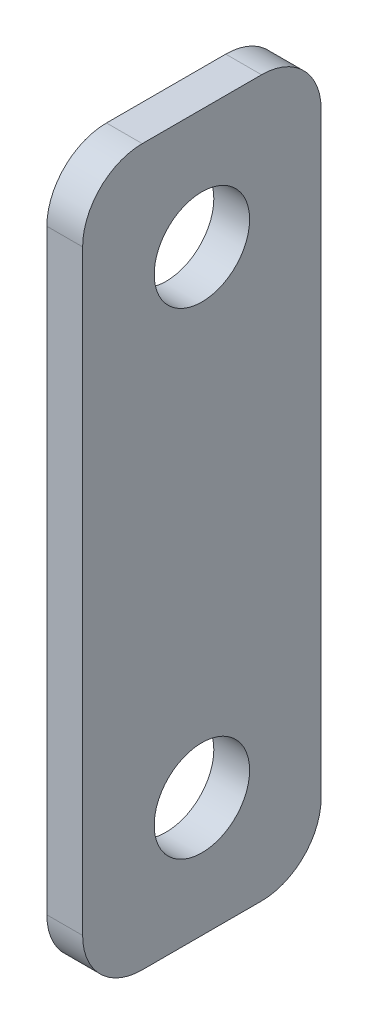
ISO-10303-21;
HEADER;
FILE_DESCRIPTION(('STEP AP214'),'2;1');
FILE_NAME('part.step','',(''),(''),'','','');
FILE_SCHEMA(('AUTOMOTIVE_DESIGN { 1 0 10303 214 1 1 1 1 }'));
ENDSEC;
DATA;
#1=APPLICATION_CONTEXT('core data for automotive mechanical design processes');
#2=APPLICATION_PROTOCOL_DEFINITION('international standard','automotive_design',2000,#1);
#3=PRODUCT_CONTEXT('',#1,'mechanical');
#4=PRODUCT('Part','Part','',(#3));
#5=PRODUCT_RELATED_PRODUCT_CATEGORY('part','',(#4));
#6=PRODUCT_DEFINITION_FORMATION('','',#4);
#7=PRODUCT_DEFINITION_CONTEXT('part definition',#1,'design');
#8=PRODUCT_DEFINITION('design','',#6,#7);
#9=PRODUCT_DEFINITION_SHAPE('','',#8);
#10=(LENGTH_UNIT() NAMED_UNIT(*) SI_UNIT(.MILLI.,.METRE.));
#11=(NAMED_UNIT(*) PLANE_ANGLE_UNIT() SI_UNIT($,.RADIAN.));
#12=(NAMED_UNIT(*) SI_UNIT($,.STERADIAN.) SOLID_ANGLE_UNIT());
#13=UNCERTAINTY_MEASURE_WITH_UNIT(LENGTH_MEASURE(1.E-05),#10,'distance_accuracy_value','');
#14=(GEOMETRIC_REPRESENTATION_CONTEXT(3) GLOBAL_UNCERTAINTY_ASSIGNED_CONTEXT((#13)) GLOBAL_UNIT_ASSIGNED_CONTEXT((#10,
#11,#12)) REPRESENTATION_CONTEXT('',''));
#15=CARTESIAN_POINT('',(0.,0.,0.));
#16=DIRECTION('',(0.,0.,1.));
#17=DIRECTION('',(1.,0.,0.));
#18=AXIS2_PLACEMENT_3D('',#15,#16,#17);
#19=CARTESIAN_POINT('',(3.,0.,0.));
#20=DIRECTION('',(-1.,0.,0.));
#21=DIRECTION('',(0.,0.,1.));
#22=AXIS2_PLACEMENT_3D('',#19,#20,#21);
#23=PLANE('',#22);
#24=DIRECTION('',(0.,0.,-1.));
#25=VECTOR('',#24,1.);
#26=CARTESIAN_POINT('',(3.,0.,0.));
#27=LINE('',#26,#25);
#28=CARTESIAN_POINT('',(3.,0.,-5.));
#29=VERTEX_POINT('',#28);
#30=CARTESIAN_POINT('',(3.,0.,-15.));
#31=VERTEX_POINT('',#30);
#32=EDGE_CURVE('E169',#29,#31,#27,.T.);
#33=ORIENTED_EDGE('',*,*,#32,.T.);
#34=CARTESIAN_POINT('',(3.,5.,-15.));
#35=DIRECTION('',(-1.,0.,0.));
#36=DIRECTION('',(0.,0.,1.));
#37=AXIS2_PLACEMENT_3D('',#34,#35,#36);
#38=CIRCLE('',#37,5.);
#39=CARTESIAN_POINT('',(3.,5.,-20.));
#40=VERTEX_POINT('',#39);
#41=EDGE_CURVE('E147',#31,#40,#38,.F.);
#42=ORIENTED_EDGE('',*,*,#41,.T.);
#43=DIRECTION('',(0.,1.,0.));
#44=VECTOR('',#43,1.);
#45=CARTESIAN_POINT('',(3.,0.,-20.));
#46=LINE('',#45,#44);
#47=CARTESIAN_POINT('',(3.,55.,-20.));
#48=VERTEX_POINT('',#47);
#49=EDGE_CURVE('E117',#40,#48,#46,.T.);
#50=ORIENTED_EDGE('',*,*,#49,.T.);
#51=CARTESIAN_POINT('',(3.,55.,-15.));
#52=DIRECTION('',(-1.,0.,0.));
#53=DIRECTION('',(0.,0.,1.));
#54=AXIS2_PLACEMENT_3D('',#51,#52,#53);
#55=CIRCLE('',#54,5.);
#56=CARTESIAN_POINT('',(3.,60.,-15.));
#57=VERTEX_POINT('',#56);
#58=EDGE_CURVE('E53',#48,#57,#55,.F.);
#59=ORIENTED_EDGE('',*,*,#58,.T.);
#60=DIRECTION('',(0.,0.,1.));
#61=VECTOR('',#60,1.);
#62=CARTESIAN_POINT('',(3.,60.,0.));
#63=LINE('',#62,#61);
#64=CARTESIAN_POINT('',(3.,60.,-5.));
#65=VERTEX_POINT('',#64);
#66=EDGE_CURVE('E133',#57,#65,#63,.T.);
#67=ORIENTED_EDGE('',*,*,#66,.T.);
#68=CARTESIAN_POINT('',(3.,55.,-5.));
#69=DIRECTION('',(-1.,0.,0.));
#70=DIRECTION('',(0.,0.,1.));
#71=AXIS2_PLACEMENT_3D('',#68,#69,#70);
#72=CIRCLE('',#71,5.);
#73=CARTESIAN_POINT('',(3.,55.,0.));
#74=VERTEX_POINT('',#73);
#75=EDGE_CURVE('E143',#65,#74,#72,.F.);
#76=ORIENTED_EDGE('',*,*,#75,.T.);
#77=DIRECTION('',(0.,-1.,0.));
#78=VECTOR('',#77,1.);
#79=CARTESIAN_POINT('',(3.,0.,0.));
#80=LINE('',#79,#78);
#81=CARTESIAN_POINT('',(3.,5.,0.));
#82=VERTEX_POINT('',#81);
#83=EDGE_CURVE('E127',#74,#82,#80,.T.);
#84=ORIENTED_EDGE('',*,*,#83,.T.);
#85=CARTESIAN_POINT('',(3.,5.,-5.));
#86=DIRECTION('',(-1.,0.,0.));
#87=DIRECTION('',(0.,0.,1.));
#88=AXIS2_PLACEMENT_3D('',#85,#86,#87);
#89=CIRCLE('',#88,5.);
#90=EDGE_CURVE('E145',#82,#29,#89,.F.);
#91=ORIENTED_EDGE('',*,*,#90,.T.);
#92=EDGE_LOOP('',(#33,#42,#50,#59,#67,#76,#84,#91));
#93=FACE_BOUND('',#92,.T.);
#94=CARTESIAN_POINT('',(3.,50.,-10.));
#95=DIRECTION('',(1.,0.,0.));
#96=DIRECTION('',(0.,0.,-1.));
#97=AXIS2_PLACEMENT_3D('',#94,#95,#96);
#98=CIRCLE('',#97,4.);
#99=CARTESIAN_POINT('',(3.,50.,-14.));
#100=VERTEX_POINT('',#99);
#101=EDGE_CURVE('E178',#100,#100,#98,.T.);
#102=ORIENTED_EDGE('',*,*,#101,.F.);
#103=EDGE_LOOP('',(#102));
#104=FACE_BOUND('',#103,.T.);
#105=CARTESIAN_POINT('',(3.,10.,-10.));
#106=DIRECTION('',(1.,0.,0.));
#107=DIRECTION('',(0.,0.,-1.));
#108=AXIS2_PLACEMENT_3D('',#105,#106,#107);
#109=CIRCLE('',#108,4.);
#110=CARTESIAN_POINT('',(3.,10.,-14.));
#111=VERTEX_POINT('',#110);
#112=EDGE_CURVE('E183',#111,#111,#109,.T.);
#113=ORIENTED_EDGE('',*,*,#112,.F.);
#114=EDGE_LOOP('',(#113));
#115=FACE_BOUND('',#114,.T.);
#116=ADVANCED_FACE('F33',(#93,#104,#115),#23,.F.);
#117=CARTESIAN_POINT('',(0.,0.,0.));
#118=DIRECTION('',(-1.,0.,0.));
#119=DIRECTION('',(0.,0.,1.));
#120=AXIS2_PLACEMENT_3D('',#117,#118,#119);
#121=PLANE('',#120);
#122=CARTESIAN_POINT('',(0.,50.,-10.));
#123=DIRECTION('',(1.,0.,0.));
#124=DIRECTION('',(0.,0.,-1.));
#125=AXIS2_PLACEMENT_3D('',#122,#123,#124);
#126=CIRCLE('',#125,4.);
#127=CARTESIAN_POINT('',(0.,50.,-14.));
#128=VERTEX_POINT('',#127);
#129=EDGE_CURVE('E174',#128,#128,#126,.T.);
#130=ORIENTED_EDGE('',*,*,#129,.T.);
#131=EDGE_LOOP('',(#130));
#132=FACE_BOUND('',#131,.T.);
#133=DIRECTION('',(0.,1.,0.));
#134=VECTOR('',#133,1.);
#135=CARTESIAN_POINT('',(0.,0.,-20.));
#136=LINE('',#135,#134);
#137=CARTESIAN_POINT('',(0.,5.,-20.));
#138=VERTEX_POINT('',#137);
#139=CARTESIAN_POINT('',(0.,55.,-20.));
#140=VERTEX_POINT('',#139);
#141=EDGE_CURVE('E115',#138,#140,#136,.T.);
#142=ORIENTED_EDGE('',*,*,#141,.F.);
#143=CARTESIAN_POINT('',(0.,5.,-15.));
#144=DIRECTION('',(-1.,0.,0.));
#145=DIRECTION('',(0.,0.,1.));
#146=AXIS2_PLACEMENT_3D('',#143,#144,#145);
#147=CIRCLE('',#146,5.);
#148=CARTESIAN_POINT('',(0.,0.,-15.));
#149=VERTEX_POINT('',#148);
#150=EDGE_CURVE('E98',#138,#149,#147,.T.);
#151=ORIENTED_EDGE('',*,*,#150,.T.);
#152=DIRECTION('',(0.,0.,-1.));
#153=VECTOR('',#152,1.);
#154=CARTESIAN_POINT('',(0.,0.,0.));
#155=LINE('',#154,#153);
#156=CARTESIAN_POINT('',(0.,0.,-5.));
#157=VERTEX_POINT('',#156);
#158=EDGE_CURVE('E125',#157,#149,#155,.T.);
#159=ORIENTED_EDGE('',*,*,#158,.F.);
#160=CARTESIAN_POINT('',(0.,5.,-5.));
#161=DIRECTION('',(-1.,0.,0.));
#162=DIRECTION('',(0.,0.,1.));
#163=AXIS2_PLACEMENT_3D('',#160,#161,#162);
#164=CIRCLE('',#163,5.);
#165=CARTESIAN_POINT('',(0.,5.,0.));
#166=VERTEX_POINT('',#165);
#167=EDGE_CURVE('E109',#157,#166,#164,.T.);
#168=ORIENTED_EDGE('',*,*,#167,.T.);
#169=DIRECTION('',(0.,-1.,0.));
#170=VECTOR('',#169,1.);
#171=CARTESIAN_POINT('',(0.,0.,0.));
#172=LINE('',#171,#170);
#173=CARTESIAN_POINT('',(0.,55.,0.));
#174=VERTEX_POINT('',#173);
#175=EDGE_CURVE('E129',#174,#166,#172,.T.);
#176=ORIENTED_EDGE('',*,*,#175,.F.);
#177=CARTESIAN_POINT('',(0.,55.,-5.));
#178=DIRECTION('',(-1.,0.,0.));
#179=DIRECTION('',(0.,0.,1.));
#180=AXIS2_PLACEMENT_3D('',#177,#178,#179);
#181=CIRCLE('',#180,5.);
#182=CARTESIAN_POINT('',(0.,60.,-5.));
#183=VERTEX_POINT('',#182);
#184=EDGE_CURVE('E136',#174,#183,#181,.T.);
#185=ORIENTED_EDGE('',*,*,#184,.T.);
#186=DIRECTION('',(0.,0.,1.));
#187=VECTOR('',#186,1.);
#188=CARTESIAN_POINT('',(0.,60.,0.));
#189=LINE('',#188,#187);
#190=CARTESIAN_POINT('',(0.,60.,-15.));
#191=VERTEX_POINT('',#190);
#192=EDGE_CURVE('E124',#191,#183,#189,.T.);
#193=ORIENTED_EDGE('',*,*,#192,.F.);
#194=CARTESIAN_POINT('',(0.,55.,-15.));
#195=DIRECTION('',(-1.,0.,0.));
#196=DIRECTION('',(0.,0.,1.));
#197=AXIS2_PLACEMENT_3D('',#194,#195,#196);
#198=CIRCLE('',#197,5.);
#199=EDGE_CURVE('E118',#191,#140,#198,.T.);
#200=ORIENTED_EDGE('',*,*,#199,.T.);
#201=EDGE_LOOP('',(#142,#151,#159,#168,#176,#185,#193,#200));
#202=FACE_BOUND('',#201,.T.);
#203=CARTESIAN_POINT('',(0.,10.,-10.));
#204=DIRECTION('',(1.,0.,0.));
#205=DIRECTION('',(0.,0.,-1.));
#206=AXIS2_PLACEMENT_3D('',#203,#204,#205);
#207=CIRCLE('',#206,4.);
#208=CARTESIAN_POINT('',(0.,10.,-14.));
#209=VERTEX_POINT('',#208);
#210=EDGE_CURVE('E185',#209,#209,#207,.T.);
#211=ORIENTED_EDGE('',*,*,#210,.T.);
#212=EDGE_LOOP('',(#211));
#213=FACE_BOUND('',#212,.T.);
#214=ADVANCED_FACE('F121',(#132,#202,#213),#121,.T.);
#215=CARTESIAN_POINT('',(3.,0.,0.));
#216=DIRECTION('',(0.,0.,-1.));
#217=DIRECTION('',(-1.,0.,0.));
#218=AXIS2_PLACEMENT_3D('',#215,#216,#217);
#219=PLANE('',#218);
#220=ORIENTED_EDGE('',*,*,#175,.T.);
#221=DIRECTION('',(-1.,0.,0.));
#222=VECTOR('',#221,1.);
#223=CARTESIAN_POINT('',(3.,5.,0.));
#224=LINE('',#223,#222);
#225=EDGE_CURVE('E152',#166,#82,#224,.F.);
#226=ORIENTED_EDGE('',*,*,#225,.T.);
#227=ORIENTED_EDGE('',*,*,#83,.F.);
#228=DIRECTION('',(-1.,0.,0.));
#229=VECTOR('',#228,1.);
#230=CARTESIAN_POINT('',(3.,55.,0.));
#231=LINE('',#230,#229);
#232=EDGE_CURVE('E149',#74,#174,#231,.T.);
#233=ORIENTED_EDGE('',*,*,#232,.T.);
#234=EDGE_LOOP('',(#220,#226,#227,#233));
#235=FACE_BOUND('',#234,.T.);
#236=ADVANCED_FACE('F165',(#235),#219,.F.);
#237=CARTESIAN_POINT('',(3.,0.,0.));
#238=DIRECTION('',(0.,1.,0.));
#239=DIRECTION('',(0.,0.,1.));
#240=AXIS2_PLACEMENT_3D('',#237,#238,#239);
#241=PLANE('',#240);
#242=ORIENTED_EDGE('',*,*,#158,.T.);
#243=DIRECTION('',(-1.,0.,0.));
#244=VECTOR('',#243,1.);
#245=CARTESIAN_POINT('',(3.,0.,-15.));
#246=LINE('',#245,#244);
#247=EDGE_CURVE('E103',#149,#31,#246,.F.);
#248=ORIENTED_EDGE('',*,*,#247,.T.);
#249=ORIENTED_EDGE('',*,*,#32,.F.);
#250=DIRECTION('',(-1.,0.,0.));
#251=VECTOR('',#250,1.);
#252=CARTESIAN_POINT('',(3.,0.,-5.));
#253=LINE('',#252,#251);
#254=EDGE_CURVE('E108',#29,#157,#253,.T.);
#255=ORIENTED_EDGE('',*,*,#254,.T.);
#256=EDGE_LOOP('',(#242,#248,#249,#255));
#257=FACE_BOUND('',#256,.T.);
#258=ADVANCED_FACE('F210',(#257),#241,.F.);
#259=CARTESIAN_POINT('',(3.,0.,-20.));
#260=DIRECTION('',(0.,0.,1.));
#261=DIRECTION('',(1.,0.,0.));
#262=AXIS2_PLACEMENT_3D('',#259,#260,#261);
#263=PLANE('',#262);
#264=ORIENTED_EDGE('',*,*,#49,.F.);
#265=DIRECTION('',(-1.,0.,0.));
#266=VECTOR('',#265,1.);
#267=CARTESIAN_POINT('',(3.,5.,-20.));
#268=LINE('',#267,#266);
#269=EDGE_CURVE('E102',#40,#138,#268,.T.);
#270=ORIENTED_EDGE('',*,*,#269,.T.);
#271=ORIENTED_EDGE('',*,*,#141,.T.);
#272=DIRECTION('',(-1.,0.,0.));
#273=VECTOR('',#272,1.);
#274=CARTESIAN_POINT('',(3.,55.,-20.));
#275=LINE('',#274,#273);
#276=EDGE_CURVE('E119',#140,#48,#275,.F.);
#277=ORIENTED_EDGE('',*,*,#276,.T.);
#278=EDGE_LOOP('',(#264,#270,#271,#277));
#279=FACE_BOUND('',#278,.T.);
#280=ADVANCED_FACE('F114',(#279),#263,.F.);
#281=CARTESIAN_POINT('',(3.,60.,0.));
#282=DIRECTION('',(0.,-1.,0.));
#283=DIRECTION('',(0.,0.,-1.));
#284=AXIS2_PLACEMENT_3D('',#281,#282,#283);
#285=PLANE('',#284);
#286=ORIENTED_EDGE('',*,*,#192,.T.);
#287=DIRECTION('',(-1.,0.,0.));
#288=VECTOR('',#287,1.);
#289=CARTESIAN_POINT('',(3.,60.,-5.));
#290=LINE('',#289,#288);
#291=EDGE_CURVE('E11',#183,#65,#290,.F.);
#292=ORIENTED_EDGE('',*,*,#291,.T.);
#293=ORIENTED_EDGE('',*,*,#66,.F.);
#294=DIRECTION('',(-1.,0.,0.));
#295=VECTOR('',#294,1.);
#296=CARTESIAN_POINT('',(3.,60.,-15.));
#297=LINE('',#296,#295);
#298=EDGE_CURVE('E41',#57,#191,#297,.T.);
#299=ORIENTED_EDGE('',*,*,#298,.T.);
#300=EDGE_LOOP('',(#286,#292,#293,#299));
#301=FACE_BOUND('',#300,.T.);
#302=ADVANCED_FACE('F155',(#301),#285,.F.);
#303=CARTESIAN_POINT('',(3.,50.,-10.));
#304=DIRECTION('',(-1.,0.,0.));
#305=DIRECTION('',(0.,0.,1.));
#306=AXIS2_PLACEMENT_3D('',#303,#304,#305);
#307=CYLINDRICAL_SURFACE('',#306,4.);
#308=ORIENTED_EDGE('',*,*,#101,.T.);
#309=EDGE_LOOP('',(#308));
#310=FACE_BOUND('',#309,.T.);
#311=ORIENTED_EDGE('',*,*,#129,.F.);
#312=EDGE_LOOP('',(#311));
#313=FACE_BOUND('',#312,.T.);
#314=ADVANCED_FACE('F203',(#310,#313),#307,.F.);
#315=CARTESIAN_POINT('',(3.,10.,-10.));
#316=DIRECTION('',(-1.,0.,0.));
#317=DIRECTION('',(0.,0.,1.));
#318=AXIS2_PLACEMENT_3D('',#315,#316,#317);
#319=CYLINDRICAL_SURFACE('',#318,4.);
#320=ORIENTED_EDGE('',*,*,#112,.T.);
#321=EDGE_LOOP('',(#320));
#322=FACE_BOUND('',#321,.T.);
#323=ORIENTED_EDGE('',*,*,#210,.F.);
#324=EDGE_LOOP('',(#323));
#325=FACE_BOUND('',#324,.T.);
#326=ADVANCED_FACE('F191',(#322,#325),#319,.F.);
#327=CARTESIAN_POINT('',(3.,5.,-15.));
#328=DIRECTION('',(-1.,0.,0.));
#329=DIRECTION('',(0.,0.,1.));
#330=AXIS2_PLACEMENT_3D('',#327,#328,#329);
#331=CYLINDRICAL_SURFACE('',#330,5.);
#332=ORIENTED_EDGE('',*,*,#41,.F.);
#333=ORIENTED_EDGE('',*,*,#247,.F.);
#334=ORIENTED_EDGE('',*,*,#150,.F.);
#335=ORIENTED_EDGE('',*,*,#269,.F.);
#336=EDGE_LOOP('',(#332,#333,#334,#335));
#337=FACE_BOUND('',#336,.T.);
#338=ADVANCED_FACE('F101',(#337),#331,.T.);
#339=CARTESIAN_POINT('',(3.,5.,-5.));
#340=DIRECTION('',(-1.,0.,0.));
#341=DIRECTION('',(0.,0.,1.));
#342=AXIS2_PLACEMENT_3D('',#339,#340,#341);
#343=CYLINDRICAL_SURFACE('',#342,5.);
#344=ORIENTED_EDGE('',*,*,#90,.F.);
#345=ORIENTED_EDGE('',*,*,#225,.F.);
#346=ORIENTED_EDGE('',*,*,#167,.F.);
#347=ORIENTED_EDGE('',*,*,#254,.F.);
#348=EDGE_LOOP('',(#344,#345,#346,#347));
#349=FACE_BOUND('',#348,.T.);
#350=ADVANCED_FACE('F218',(#349),#343,.T.);
#351=CARTESIAN_POINT('',(3.,55.,-5.));
#352=DIRECTION('',(-1.,0.,0.));
#353=DIRECTION('',(0.,0.,1.));
#354=AXIS2_PLACEMENT_3D('',#351,#352,#353);
#355=CYLINDRICAL_SURFACE('',#354,5.);
#356=ORIENTED_EDGE('',*,*,#75,.F.);
#357=ORIENTED_EDGE('',*,*,#291,.F.);
#358=ORIENTED_EDGE('',*,*,#184,.F.);
#359=ORIENTED_EDGE('',*,*,#232,.F.);
#360=EDGE_LOOP('',(#356,#357,#358,#359));
#361=FACE_BOUND('',#360,.T.);
#362=ADVANCED_FACE('F162',(#361),#355,.T.);
#363=CARTESIAN_POINT('',(3.,55.,-15.));
#364=DIRECTION('',(-1.,0.,0.));
#365=DIRECTION('',(0.,0.,1.));
#366=AXIS2_PLACEMENT_3D('',#363,#364,#365);
#367=CYLINDRICAL_SURFACE('',#366,5.);
#368=ORIENTED_EDGE('',*,*,#58,.F.);
#369=ORIENTED_EDGE('',*,*,#276,.F.);
#370=ORIENTED_EDGE('',*,*,#199,.F.);
#371=ORIENTED_EDGE('',*,*,#298,.F.);
#372=EDGE_LOOP('',(#368,#369,#370,#371));
#373=FACE_BOUND('',#372,.T.);
#374=ADVANCED_FACE('F35',(#373),#367,.T.);
#375=CLOSED_SHELL('',(#116,#214,#236,#258,#280,#302,#314,#326,#338,#350,#362,#374));
#376=MANIFOLD_SOLID_BREP('B2',#375);
#377=ADVANCED_BREP_SHAPE_REPRESENTATION('',(#18,#376),#14);
#378=SHAPE_DEFINITION_REPRESENTATION(#9,#377);
ENDSEC;
END-ISO-10303-21;
